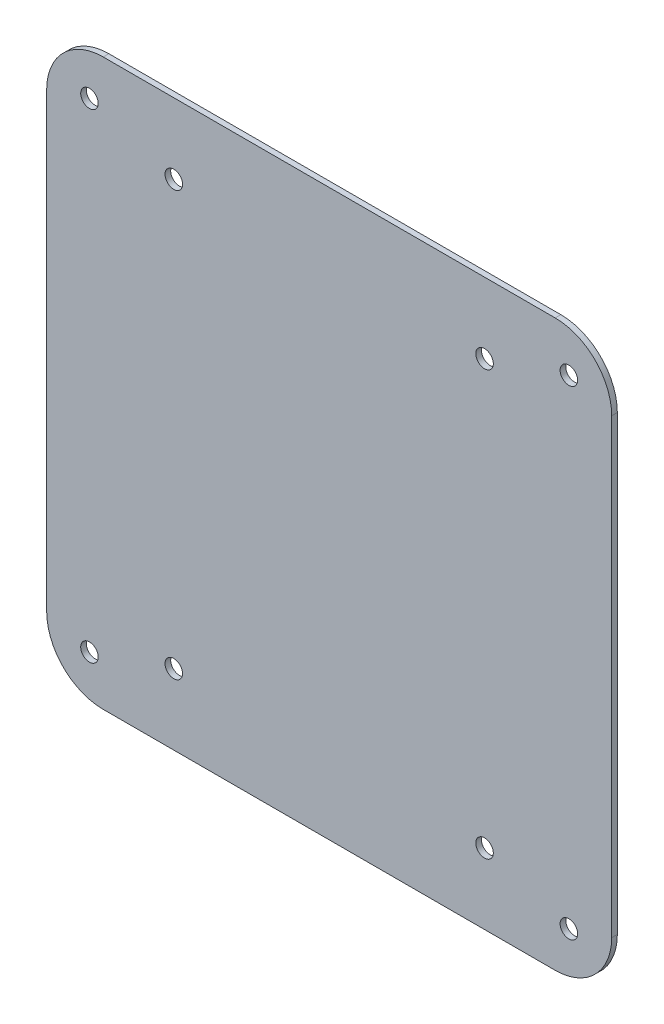
ISO-10303-21;
HEADER;
FILE_DESCRIPTION(('STEP AP214'),'2;1');
FILE_NAME('part.step','',(''),(''),'','','');
FILE_SCHEMA(('AUTOMOTIVE_DESIGN { 1 0 10303 214 1 1 1 1 }'));
ENDSEC;
DATA;
#1=APPLICATION_CONTEXT('core data for automotive mechanical design processes');
#2=APPLICATION_PROTOCOL_DEFINITION('international standard','automotive_design',2000,#1);
#3=PRODUCT_CONTEXT('',#1,'mechanical');
#4=PRODUCT('Part','Part','',(#3));
#5=PRODUCT_RELATED_PRODUCT_CATEGORY('part','',(#4));
#6=PRODUCT_DEFINITION_FORMATION('','',#4);
#7=PRODUCT_DEFINITION_CONTEXT('part definition',#1,'design');
#8=PRODUCT_DEFINITION('design','',#6,#7);
#9=PRODUCT_DEFINITION_SHAPE('','',#8);
#10=(LENGTH_UNIT() NAMED_UNIT(*) SI_UNIT(.MILLI.,.METRE.));
#11=(NAMED_UNIT(*) PLANE_ANGLE_UNIT() SI_UNIT($,.RADIAN.));
#12=(NAMED_UNIT(*) SI_UNIT($,.STERADIAN.) SOLID_ANGLE_UNIT());
#13=UNCERTAINTY_MEASURE_WITH_UNIT(LENGTH_MEASURE(1.E-05),#10,'distance_accuracy_value','');
#14=(GEOMETRIC_REPRESENTATION_CONTEXT(3) GLOBAL_UNCERTAINTY_ASSIGNED_CONTEXT((#13)) GLOBAL_UNIT_ASSIGNED_CONTEXT((#10,
#11,#12)) REPRESENTATION_CONTEXT('',''));
#15=CARTESIAN_POINT('',(0.,0.,0.));
#16=DIRECTION('',(0.,0.,1.));
#17=DIRECTION('',(1.,0.,0.));
#18=AXIS2_PLACEMENT_3D('',#15,#16,#17);
#19=CARTESIAN_POINT('',(40.,40.,1.));
#20=DIRECTION('',(0.,0.,-1.));
#21=DIRECTION('',(-1.,0.,0.));
#22=AXIS2_PLACEMENT_3D('',#19,#20,#21);
#23=PLANE('',#22);
#24=CARTESIAN_POINT('',(40.,40.,1.));
#25=DIRECTION('',(0.,0.,1.));
#26=DIRECTION('',(-1.,0.,0.));
#27=AXIS2_PLACEMENT_3D('',#24,#25,#26);
#28=CIRCLE('',#27,10.);
#29=CARTESIAN_POINT('',(50.,40.,1.));
#30=VERTEX_POINT('',#29);
#31=CARTESIAN_POINT('',(40.,50.,1.));
#32=VERTEX_POINT('',#31);
#33=EDGE_CURVE('E164',#30,#32,#28,.T.);
#34=ORIENTED_EDGE('',*,*,#33,.T.);
#35=DIRECTION('',(-1.,0.,0.));
#36=VECTOR('',#35,1.);
#37=CARTESIAN_POINT('',(-40.,50.,1.));
#38=LINE('',#37,#36);
#39=CARTESIAN_POINT('',(-40.,50.,1.));
#40=VERTEX_POINT('',#39);
#41=EDGE_CURVE('E100',#32,#40,#38,.T.);
#42=ORIENTED_EDGE('',*,*,#41,.T.);
#43=CARTESIAN_POINT('',(-40.,40.,1.));
#44=DIRECTION('',(0.,0.,1.));
#45=DIRECTION('',(-1.,0.,0.));
#46=AXIS2_PLACEMENT_3D('',#43,#44,#45);
#47=CIRCLE('',#46,10.);
#48=CARTESIAN_POINT('',(-50.,40.,1.));
#49=VERTEX_POINT('',#48);
#50=EDGE_CURVE('E185',#40,#49,#47,.T.);
#51=ORIENTED_EDGE('',*,*,#50,.T.);
#52=DIRECTION('',(0.,-1.,0.));
#53=VECTOR('',#52,1.);
#54=CARTESIAN_POINT('',(-50.,-40.,1.));
#55=LINE('',#54,#53);
#56=CARTESIAN_POINT('',(-50.,-40.,1.));
#57=VERTEX_POINT('',#56);
#58=EDGE_CURVE('E199',#49,#57,#55,.T.);
#59=ORIENTED_EDGE('',*,*,#58,.T.);
#60=CARTESIAN_POINT('',(-40.,-40.,1.));
#61=DIRECTION('',(0.,0.,1.));
#62=DIRECTION('',(-1.,0.,0.));
#63=AXIS2_PLACEMENT_3D('',#60,#61,#62);
#64=CIRCLE('',#63,10.);
#65=CARTESIAN_POINT('',(-40.,-50.,1.));
#66=VERTEX_POINT('',#65);
#67=EDGE_CURVE('E119',#57,#66,#64,.T.);
#68=ORIENTED_EDGE('',*,*,#67,.T.);
#69=DIRECTION('',(1.,0.,0.));
#70=VECTOR('',#69,1.);
#71=CARTESIAN_POINT('',(-40.,-50.,1.));
#72=LINE('',#71,#70);
#73=CARTESIAN_POINT('',(40.,-50.,1.));
#74=VERTEX_POINT('',#73);
#75=EDGE_CURVE('E113',#66,#74,#72,.T.);
#76=ORIENTED_EDGE('',*,*,#75,.T.);
#77=CARTESIAN_POINT('',(40.,-40.,1.));
#78=DIRECTION('',(0.,0.,1.));
#79=DIRECTION('',(1.,0.,0.));
#80=AXIS2_PLACEMENT_3D('',#77,#78,#79);
#81=CIRCLE('',#80,10.);
#82=CARTESIAN_POINT('',(50.,-40.,1.));
#83=VERTEX_POINT('',#82);
#84=EDGE_CURVE('E117',#74,#83,#81,.T.);
#85=ORIENTED_EDGE('',*,*,#84,.T.);
#86=DIRECTION('',(0.,1.,0.));
#87=VECTOR('',#86,1.);
#88=CARTESIAN_POINT('',(50.,-40.,1.));
#89=LINE('',#88,#87);
#90=EDGE_CURVE('E57',#83,#30,#89,.T.);
#91=ORIENTED_EDGE('',*,*,#90,.T.);
#92=EDGE_LOOP('',(#34,#42,#51,#59,#68,#76,#85,#91));
#93=FACE_BOUND('',#92,.T.);
#94=CARTESIAN_POINT('',(-27.5,37.5,1.));
#95=DIRECTION('',(0.,0.,1.));
#96=DIRECTION('',(1.,0.,0.));
#97=AXIS2_PLACEMENT_3D('',#94,#95,#96);
#98=CIRCLE('',#97,1.55);
#99=CARTESIAN_POINT('',(-25.95,37.5,1.));
#100=VERTEX_POINT('',#99);
#101=EDGE_CURVE('E146',#100,#100,#98,.T.);
#102=ORIENTED_EDGE('',*,*,#101,.F.);
#103=EDGE_LOOP('',(#102));
#104=FACE_BOUND('',#103,.T.);
#105=CARTESIAN_POINT('',(27.5,37.5,1.));
#106=DIRECTION('',(0.,0.,1.));
#107=DIRECTION('',(1.,0.,0.));
#108=AXIS2_PLACEMENT_3D('',#105,#106,#107);
#109=CIRCLE('',#108,1.55);
#110=CARTESIAN_POINT('',(29.05,37.5,1.));
#111=VERTEX_POINT('',#110);
#112=EDGE_CURVE('E213',#111,#111,#109,.T.);
#113=ORIENTED_EDGE('',*,*,#112,.F.);
#114=EDGE_LOOP('',(#113));
#115=FACE_BOUND('',#114,.T.);
#116=CARTESIAN_POINT('',(27.5,-37.5,1.));
#117=DIRECTION('',(0.,0.,1.));
#118=DIRECTION('',(1.,0.,0.));
#119=AXIS2_PLACEMENT_3D('',#116,#117,#118);
#120=CIRCLE('',#119,1.55);
#121=CARTESIAN_POINT('',(29.05,-37.5,1.));
#122=VERTEX_POINT('',#121);
#123=EDGE_CURVE('E221',#122,#122,#120,.T.);
#124=ORIENTED_EDGE('',*,*,#123,.F.);
#125=EDGE_LOOP('',(#124));
#126=FACE_BOUND('',#125,.T.);
#127=CARTESIAN_POINT('',(-27.5,-37.5,1.));
#128=DIRECTION('',(0.,0.,1.));
#129=DIRECTION('',(1.,0.,0.));
#130=AXIS2_PLACEMENT_3D('',#127,#128,#129);
#131=CIRCLE('',#130,1.55);
#132=CARTESIAN_POINT('',(-25.95,-37.5,1.));
#133=VERTEX_POINT('',#132);
#134=EDGE_CURVE('E229',#133,#133,#131,.T.);
#135=ORIENTED_EDGE('',*,*,#134,.F.);
#136=EDGE_LOOP('',(#135));
#137=FACE_BOUND('',#136,.T.);
#138=CARTESIAN_POINT('',(-42.4264068711929,42.4264068711928,1.));
#139=DIRECTION('',(0.,0.,1.));
#140=DIRECTION('',(1.,0.,0.));
#141=AXIS2_PLACEMENT_3D('',#138,#139,#140);
#142=CIRCLE('',#141,1.55);
#143=CARTESIAN_POINT('',(-40.8764068711928,42.4264068711928,1.));
#144=VERTEX_POINT('',#143);
#145=EDGE_CURVE('E237',#144,#144,#142,.T.);
#146=ORIENTED_EDGE('',*,*,#145,.F.);
#147=EDGE_LOOP('',(#146));
#148=FACE_BOUND('',#147,.T.);
#149=CARTESIAN_POINT('',(42.4264068711928,42.4264068711928,1.));
#150=DIRECTION('',(0.,0.,1.));
#151=DIRECTION('',(-1.,0.,0.));
#152=AXIS2_PLACEMENT_3D('',#149,#150,#151);
#153=CIRCLE('',#152,1.55);
#154=CARTESIAN_POINT('',(40.8764068711928,42.4264068711928,1.));
#155=VERTEX_POINT('',#154);
#156=EDGE_CURVE('E245',#155,#155,#153,.T.);
#157=ORIENTED_EDGE('',*,*,#156,.F.);
#158=EDGE_LOOP('',(#157));
#159=FACE_BOUND('',#158,.T.);
#160=CARTESIAN_POINT('',(42.4264068711928,-42.4264068711928,1.));
#161=DIRECTION('',(0.,0.,1.));
#162=DIRECTION('',(1.,0.,0.));
#163=AXIS2_PLACEMENT_3D('',#160,#161,#162);
#164=CIRCLE('',#163,1.55);
#165=CARTESIAN_POINT('',(43.9764068711928,-42.4264068711928,1.));
#166=VERTEX_POINT('',#165);
#167=EDGE_CURVE('E253',#166,#166,#164,.T.);
#168=ORIENTED_EDGE('',*,*,#167,.F.);
#169=EDGE_LOOP('',(#168));
#170=FACE_BOUND('',#169,.T.);
#171=CARTESIAN_POINT('',(-42.4264068711929,-42.4264068711928,1.));
#172=DIRECTION('',(0.,0.,1.));
#173=DIRECTION('',(-1.,0.,0.));
#174=AXIS2_PLACEMENT_3D('',#171,#172,#173);
#175=CIRCLE('',#174,1.55);
#176=CARTESIAN_POINT('',(-43.9764068711929,-42.4264068711928,1.));
#177=VERTEX_POINT('',#176);
#178=EDGE_CURVE('E261',#177,#177,#175,.T.);
#179=ORIENTED_EDGE('',*,*,#178,.F.);
#180=EDGE_LOOP('',(#179));
#181=FACE_BOUND('',#180,.T.);
#182=ADVANCED_FACE('F39',(#93,#104,#115,#126,#137,#148,#159,#170,#181),#23,.F.);
#183=CARTESIAN_POINT('',(40.,40.,0.));
#184=DIRECTION('',(0.,0.,-1.));
#185=DIRECTION('',(-1.,0.,0.));
#186=AXIS2_PLACEMENT_3D('',#183,#184,#185);
#187=PLANE('',#186);
#188=CARTESIAN_POINT('',(42.4264068711928,-42.4264068711928,0.));
#189=DIRECTION('',(0.,0.,1.));
#190=DIRECTION('',(1.,0.,0.));
#191=AXIS2_PLACEMENT_3D('',#188,#189,#190);
#192=CIRCLE('',#191,1.55);
#193=CARTESIAN_POINT('',(43.9764068711928,-42.4264068711928,0.));
#194=VERTEX_POINT('',#193);
#195=EDGE_CURVE('E257',#194,#194,#192,.T.);
#196=ORIENTED_EDGE('',*,*,#195,.T.);
#197=EDGE_LOOP('',(#196));
#198=FACE_BOUND('',#197,.T.);
#199=CARTESIAN_POINT('',(-42.4264068711929,42.4264068711928,0.));
#200=DIRECTION('',(0.,0.,1.));
#201=DIRECTION('',(1.,0.,0.));
#202=AXIS2_PLACEMENT_3D('',#199,#200,#201);
#203=CIRCLE('',#202,1.55);
#204=CARTESIAN_POINT('',(-40.8764068711928,42.4264068711928,0.));
#205=VERTEX_POINT('',#204);
#206=EDGE_CURVE('E241',#205,#205,#203,.T.);
#207=ORIENTED_EDGE('',*,*,#206,.T.);
#208=EDGE_LOOP('',(#207));
#209=FACE_BOUND('',#208,.T.);
#210=CARTESIAN_POINT('',(27.5,-37.5,0.));
#211=DIRECTION('',(0.,0.,1.));
#212=DIRECTION('',(1.,0.,0.));
#213=AXIS2_PLACEMENT_3D('',#210,#211,#212);
#214=CIRCLE('',#213,1.55);
#215=CARTESIAN_POINT('',(29.05,-37.5,0.));
#216=VERTEX_POINT('',#215);
#217=EDGE_CURVE('E225',#216,#216,#214,.T.);
#218=ORIENTED_EDGE('',*,*,#217,.T.);
#219=EDGE_LOOP('',(#218));
#220=FACE_BOUND('',#219,.T.);
#221=CARTESIAN_POINT('',(-27.5,37.5,0.));
#222=DIRECTION('',(0.,0.,1.));
#223=DIRECTION('',(1.,0.,0.));
#224=AXIS2_PLACEMENT_3D('',#221,#222,#223);
#225=CIRCLE('',#224,1.55);
#226=CARTESIAN_POINT('',(-25.95,37.5,0.));
#227=VERTEX_POINT('',#226);
#228=EDGE_CURVE('E209',#227,#227,#225,.T.);
#229=ORIENTED_EDGE('',*,*,#228,.T.);
#230=EDGE_LOOP('',(#229));
#231=FACE_BOUND('',#230,.T.);
#232=CARTESIAN_POINT('',(40.,40.,0.));
#233=DIRECTION('',(0.,0.,1.));
#234=DIRECTION('',(-1.,0.,0.));
#235=AXIS2_PLACEMENT_3D('',#232,#233,#234);
#236=CIRCLE('',#235,10.);
#237=CARTESIAN_POINT('',(50.,40.,0.));
#238=VERTEX_POINT('',#237);
#239=CARTESIAN_POINT('',(40.,50.,0.));
#240=VERTEX_POINT('',#239);
#241=EDGE_CURVE('E141',#238,#240,#236,.T.);
#242=ORIENTED_EDGE('',*,*,#241,.F.);
#243=DIRECTION('',(0.,1.,0.));
#244=VECTOR('',#243,1.);
#245=CARTESIAN_POINT('',(50.,-40.,0.));
#246=LINE('',#245,#244);
#247=CARTESIAN_POINT('',(50.,-40.,0.));
#248=VERTEX_POINT('',#247);
#249=EDGE_CURVE('E92',#248,#238,#246,.T.);
#250=ORIENTED_EDGE('',*,*,#249,.F.);
#251=CARTESIAN_POINT('',(40.,-40.,0.));
#252=DIRECTION('',(0.,0.,1.));
#253=DIRECTION('',(1.,0.,0.));
#254=AXIS2_PLACEMENT_3D('',#251,#252,#253);
#255=CIRCLE('',#254,10.);
#256=CARTESIAN_POINT('',(40.,-50.,0.));
#257=VERTEX_POINT('',#256);
#258=EDGE_CURVE('E86',#257,#248,#255,.T.);
#259=ORIENTED_EDGE('',*,*,#258,.F.);
#260=DIRECTION('',(1.,0.,0.));
#261=VECTOR('',#260,1.);
#262=CARTESIAN_POINT('',(-40.,-50.,0.));
#263=LINE('',#262,#261);
#264=CARTESIAN_POINT('',(-40.,-50.,0.));
#265=VERTEX_POINT('',#264);
#266=EDGE_CURVE('E128',#265,#257,#263,.T.);
#267=ORIENTED_EDGE('',*,*,#266,.F.);
#268=CARTESIAN_POINT('',(-40.,-40.,0.));
#269=DIRECTION('',(0.,0.,1.));
#270=DIRECTION('',(-1.,0.,0.));
#271=AXIS2_PLACEMENT_3D('',#268,#269,#270);
#272=CIRCLE('',#271,10.);
#273=CARTESIAN_POINT('',(-50.,-40.,0.));
#274=VERTEX_POINT('',#273);
#275=EDGE_CURVE('E155',#274,#265,#272,.T.);
#276=ORIENTED_EDGE('',*,*,#275,.F.);
#277=DIRECTION('',(0.,-1.,0.));
#278=VECTOR('',#277,1.);
#279=CARTESIAN_POINT('',(-50.,-40.,0.));
#280=LINE('',#279,#278);
#281=CARTESIAN_POINT('',(-50.,40.,0.));
#282=VERTEX_POINT('',#281);
#283=EDGE_CURVE('E152',#282,#274,#280,.T.);
#284=ORIENTED_EDGE('',*,*,#283,.F.);
#285=CARTESIAN_POINT('',(-40.,40.,0.));
#286=DIRECTION('',(0.,0.,1.));
#287=DIRECTION('',(-1.,0.,0.));
#288=AXIS2_PLACEMENT_3D('',#285,#286,#287);
#289=CIRCLE('',#288,10.);
#290=CARTESIAN_POINT('',(-40.,50.,0.));
#291=VERTEX_POINT('',#290);
#292=EDGE_CURVE('E149',#291,#282,#289,.T.);
#293=ORIENTED_EDGE('',*,*,#292,.F.);
#294=DIRECTION('',(-1.,0.,0.));
#295=VECTOR('',#294,1.);
#296=CARTESIAN_POINT('',(-40.,50.,0.));
#297=LINE('',#296,#295);
#298=EDGE_CURVE('E145',#240,#291,#297,.T.);
#299=ORIENTED_EDGE('',*,*,#298,.F.);
#300=EDGE_LOOP('',(#242,#250,#259,#267,#276,#284,#293,#299));
#301=FACE_BOUND('',#300,.T.);
#302=CARTESIAN_POINT('',(27.5,37.5,0.));
#303=DIRECTION('',(0.,0.,1.));
#304=DIRECTION('',(1.,0.,0.));
#305=AXIS2_PLACEMENT_3D('',#302,#303,#304);
#306=CIRCLE('',#305,1.55);
#307=CARTESIAN_POINT('',(29.05,37.5,0.));
#308=VERTEX_POINT('',#307);
#309=EDGE_CURVE('E217',#308,#308,#306,.T.);
#310=ORIENTED_EDGE('',*,*,#309,.T.);
#311=EDGE_LOOP('',(#310));
#312=FACE_BOUND('',#311,.T.);
#313=CARTESIAN_POINT('',(-27.5,-37.5,0.));
#314=DIRECTION('',(0.,0.,1.));
#315=DIRECTION('',(1.,0.,0.));
#316=AXIS2_PLACEMENT_3D('',#313,#314,#315);
#317=CIRCLE('',#316,1.55);
#318=CARTESIAN_POINT('',(-25.95,-37.5,0.));
#319=VERTEX_POINT('',#318);
#320=EDGE_CURVE('E233',#319,#319,#317,.T.);
#321=ORIENTED_EDGE('',*,*,#320,.T.);
#322=EDGE_LOOP('',(#321));
#323=FACE_BOUND('',#322,.T.);
#324=CARTESIAN_POINT('',(42.4264068711928,42.4264068711928,0.));
#325=DIRECTION('',(0.,0.,1.));
#326=DIRECTION('',(-1.,0.,0.));
#327=AXIS2_PLACEMENT_3D('',#324,#325,#326);
#328=CIRCLE('',#327,1.55);
#329=CARTESIAN_POINT('',(40.8764068711928,42.4264068711928,0.));
#330=VERTEX_POINT('',#329);
#331=EDGE_CURVE('E249',#330,#330,#328,.T.);
#332=ORIENTED_EDGE('',*,*,#331,.T.);
#333=EDGE_LOOP('',(#332));
#334=FACE_BOUND('',#333,.T.);
#335=CARTESIAN_POINT('',(-42.4264068711929,-42.4264068711928,0.));
#336=DIRECTION('',(0.,0.,1.));
#337=DIRECTION('',(-1.,0.,0.));
#338=AXIS2_PLACEMENT_3D('',#335,#336,#337);
#339=CIRCLE('',#338,1.55);
#340=CARTESIAN_POINT('',(-43.9764068711929,-42.4264068711928,0.));
#341=VERTEX_POINT('',#340);
#342=EDGE_CURVE('E265',#341,#341,#339,.T.);
#343=ORIENTED_EDGE('',*,*,#342,.T.);
#344=EDGE_LOOP('',(#343));
#345=FACE_BOUND('',#344,.T.);
#346=ADVANCED_FACE('F189',(#198,#209,#220,#231,#301,#312,#323,#334,#345),#187,.T.);
#347=CARTESIAN_POINT('',(40.,40.,1.));
#348=DIRECTION('',(0.,0.,-1.));
#349=DIRECTION('',(-1.,0.,0.));
#350=AXIS2_PLACEMENT_3D('',#347,#348,#349);
#351=CYLINDRICAL_SURFACE('',#350,10.);
#352=ORIENTED_EDGE('',*,*,#241,.T.);
#353=DIRECTION('',(0.,0.,-1.));
#354=VECTOR('',#353,1.);
#355=CARTESIAN_POINT('',(40.,50.,1.));
#356=LINE('',#355,#354);
#357=EDGE_CURVE('E11',#32,#240,#356,.T.);
#358=ORIENTED_EDGE('',*,*,#357,.F.);
#359=ORIENTED_EDGE('',*,*,#33,.F.);
#360=DIRECTION('',(0.,0.,-1.));
#361=VECTOR('',#360,1.);
#362=CARTESIAN_POINT('',(50.,40.,1.));
#363=LINE('',#362,#361);
#364=EDGE_CURVE('E137',#30,#238,#363,.T.);
#365=ORIENTED_EDGE('',*,*,#364,.T.);
#366=EDGE_LOOP('',(#352,#358,#359,#365));
#367=FACE_BOUND('',#366,.T.);
#368=ADVANCED_FACE('F41',(#367),#351,.T.);
#369=CARTESIAN_POINT('',(-40.,50.,1.));
#370=DIRECTION('',(0.,-1.,0.));
#371=DIRECTION('',(0.,0.,-1.));
#372=AXIS2_PLACEMENT_3D('',#369,#370,#371);
#373=PLANE('',#372);
#374=ORIENTED_EDGE('',*,*,#298,.T.);
#375=DIRECTION('',(0.,0.,-1.));
#376=VECTOR('',#375,1.);
#377=CARTESIAN_POINT('',(-40.,50.,1.));
#378=LINE('',#377,#376);
#379=EDGE_CURVE('E49',#40,#291,#378,.T.);
#380=ORIENTED_EDGE('',*,*,#379,.F.);
#381=ORIENTED_EDGE('',*,*,#41,.F.);
#382=ORIENTED_EDGE('',*,*,#357,.T.);
#383=EDGE_LOOP('',(#374,#380,#381,#382));
#384=FACE_BOUND('',#383,.T.);
#385=ADVANCED_FACE('F299',(#384),#373,.F.);
#386=CARTESIAN_POINT('',(-40.,40.,1.));
#387=DIRECTION('',(0.,0.,-1.));
#388=DIRECTION('',(-1.,0.,0.));
#389=AXIS2_PLACEMENT_3D('',#386,#387,#388);
#390=CYLINDRICAL_SURFACE('',#389,10.);
#391=ORIENTED_EDGE('',*,*,#292,.T.);
#392=DIRECTION('',(0.,0.,-1.));
#393=VECTOR('',#392,1.);
#394=CARTESIAN_POINT('',(-50.,40.,1.));
#395=LINE('',#394,#393);
#396=EDGE_CURVE('E175',#49,#282,#395,.T.);
#397=ORIENTED_EDGE('',*,*,#396,.F.);
#398=ORIENTED_EDGE('',*,*,#50,.F.);
#399=ORIENTED_EDGE('',*,*,#379,.T.);
#400=EDGE_LOOP('',(#391,#397,#398,#399));
#401=FACE_BOUND('',#400,.T.);
#402=ADVANCED_FACE('F183',(#401),#390,.T.);
#403=CARTESIAN_POINT('',(-50.,-40.,1.));
#404=DIRECTION('',(1.,0.,0.));
#405=DIRECTION('',(0.,0.,-1.));
#406=AXIS2_PLACEMENT_3D('',#403,#404,#405);
#407=PLANE('',#406);
#408=ORIENTED_EDGE('',*,*,#283,.T.);
#409=DIRECTION('',(0.,0.,-1.));
#410=VECTOR('',#409,1.);
#411=CARTESIAN_POINT('',(-50.,-40.,1.));
#412=LINE('',#411,#410);
#413=EDGE_CURVE('E171',#57,#274,#412,.T.);
#414=ORIENTED_EDGE('',*,*,#413,.F.);
#415=ORIENTED_EDGE('',*,*,#58,.F.);
#416=ORIENTED_EDGE('',*,*,#396,.T.);
#417=EDGE_LOOP('',(#408,#414,#415,#416));
#418=FACE_BOUND('',#417,.T.);
#419=ADVANCED_FACE('F194',(#418),#407,.F.);
#420=CARTESIAN_POINT('',(-40.,-40.,1.));
#421=DIRECTION('',(0.,0.,-1.));
#422=DIRECTION('',(-1.,0.,0.));
#423=AXIS2_PLACEMENT_3D('',#420,#421,#422);
#424=CYLINDRICAL_SURFACE('',#423,10.);
#425=ORIENTED_EDGE('',*,*,#275,.T.);
#426=DIRECTION('',(0.,0.,-1.));
#427=VECTOR('',#426,1.);
#428=CARTESIAN_POINT('',(-40.,-50.,1.));
#429=LINE('',#428,#427);
#430=EDGE_CURVE('E130',#66,#265,#429,.T.);
#431=ORIENTED_EDGE('',*,*,#430,.F.);
#432=ORIENTED_EDGE('',*,*,#67,.F.);
#433=ORIENTED_EDGE('',*,*,#413,.T.);
#434=EDGE_LOOP('',(#425,#431,#432,#433));
#435=FACE_BOUND('',#434,.T.);
#436=ADVANCED_FACE('F197',(#435),#424,.T.);
#437=CARTESIAN_POINT('',(-40.,-50.,1.));
#438=DIRECTION('',(0.,1.,0.));
#439=DIRECTION('',(0.,0.,1.));
#440=AXIS2_PLACEMENT_3D('',#437,#438,#439);
#441=PLANE('',#440);
#442=ORIENTED_EDGE('',*,*,#266,.T.);
#443=DIRECTION('',(0.,0.,-1.));
#444=VECTOR('',#443,1.);
#445=CARTESIAN_POINT('',(40.,-50.,1.));
#446=LINE('',#445,#444);
#447=EDGE_CURVE('E125',#74,#257,#446,.T.);
#448=ORIENTED_EDGE('',*,*,#447,.F.);
#449=ORIENTED_EDGE('',*,*,#75,.F.);
#450=ORIENTED_EDGE('',*,*,#430,.T.);
#451=EDGE_LOOP('',(#442,#448,#449,#450));
#452=FACE_BOUND('',#451,.T.);
#453=ADVANCED_FACE('F126',(#452),#441,.F.);
#454=CARTESIAN_POINT('',(40.,-40.,1.));
#455=DIRECTION('',(0.,0.,-1.));
#456=DIRECTION('',(-1.,0.,0.));
#457=AXIS2_PLACEMENT_3D('',#454,#455,#456);
#458=CYLINDRICAL_SURFACE('',#457,10.);
#459=ORIENTED_EDGE('',*,*,#258,.T.);
#460=DIRECTION('',(0.,0.,-1.));
#461=VECTOR('',#460,1.);
#462=CARTESIAN_POINT('',(50.,-40.,1.));
#463=LINE('',#462,#461);
#464=EDGE_CURVE('E131',#83,#248,#463,.T.);
#465=ORIENTED_EDGE('',*,*,#464,.F.);
#466=ORIENTED_EDGE('',*,*,#84,.F.);
#467=ORIENTED_EDGE('',*,*,#447,.T.);
#468=EDGE_LOOP('',(#459,#465,#466,#467));
#469=FACE_BOUND('',#468,.T.);
#470=ADVANCED_FACE('F133',(#469),#458,.T.);
#471=CARTESIAN_POINT('',(50.,-40.,1.));
#472=DIRECTION('',(-1.,0.,0.));
#473=DIRECTION('',(0.,0.,1.));
#474=AXIS2_PLACEMENT_3D('',#471,#472,#473);
#475=PLANE('',#474);
#476=ORIENTED_EDGE('',*,*,#249,.T.);
#477=ORIENTED_EDGE('',*,*,#364,.F.);
#478=ORIENTED_EDGE('',*,*,#90,.F.);
#479=ORIENTED_EDGE('',*,*,#464,.T.);
#480=EDGE_LOOP('',(#476,#477,#478,#479));
#481=FACE_BOUND('',#480,.T.);
#482=ADVANCED_FACE('F287',(#481),#475,.F.);
#483=CARTESIAN_POINT('',(-27.5,37.5,1.));
#484=DIRECTION('',(0.,0.,-1.));
#485=DIRECTION('',(-1.,0.,0.));
#486=AXIS2_PLACEMENT_3D('',#483,#484,#485);
#487=CYLINDRICAL_SURFACE('',#486,1.55);
#488=ORIENTED_EDGE('',*,*,#101,.T.);
#489=EDGE_LOOP('',(#488));
#490=FACE_BOUND('',#489,.T.);
#491=ORIENTED_EDGE('',*,*,#228,.F.);
#492=EDGE_LOOP('',(#491));
#493=FACE_BOUND('',#492,.T.);
#494=ADVANCED_FACE('F284',(#490,#493),#487,.F.);
#495=CARTESIAN_POINT('',(27.5,37.5,1.));
#496=DIRECTION('',(0.,0.,-1.));
#497=DIRECTION('',(-1.,0.,0.));
#498=AXIS2_PLACEMENT_3D('',#495,#496,#497);
#499=CYLINDRICAL_SURFACE('',#498,1.55);
#500=ORIENTED_EDGE('',*,*,#112,.T.);
#501=EDGE_LOOP('',(#500));
#502=FACE_BOUND('',#501,.T.);
#503=ORIENTED_EDGE('',*,*,#309,.F.);
#504=EDGE_LOOP('',(#503));
#505=FACE_BOUND('',#504,.T.);
#506=ADVANCED_FACE('F363',(#502,#505),#499,.F.);
#507=CARTESIAN_POINT('',(27.5,-37.5,1.));
#508=DIRECTION('',(0.,0.,-1.));
#509=DIRECTION('',(-1.,0.,0.));
#510=AXIS2_PLACEMENT_3D('',#507,#508,#509);
#511=CYLINDRICAL_SURFACE('',#510,1.55);
#512=ORIENTED_EDGE('',*,*,#123,.T.);
#513=EDGE_LOOP('',(#512));
#514=FACE_BOUND('',#513,.T.);
#515=ORIENTED_EDGE('',*,*,#217,.F.);
#516=EDGE_LOOP('',(#515));
#517=FACE_BOUND('',#516,.T.);
#518=ADVANCED_FACE('F371',(#514,#517),#511,.F.);
#519=CARTESIAN_POINT('',(-27.5,-37.5,1.));
#520=DIRECTION('',(0.,0.,-1.));
#521=DIRECTION('',(-1.,0.,0.));
#522=AXIS2_PLACEMENT_3D('',#519,#520,#521);
#523=CYLINDRICAL_SURFACE('',#522,1.55);
#524=ORIENTED_EDGE('',*,*,#134,.T.);
#525=EDGE_LOOP('',(#524));
#526=FACE_BOUND('',#525,.T.);
#527=ORIENTED_EDGE('',*,*,#320,.F.);
#528=EDGE_LOOP('',(#527));
#529=FACE_BOUND('',#528,.T.);
#530=ADVANCED_FACE('F379',(#526,#529),#523,.F.);
#531=CARTESIAN_POINT('',(-42.4264068711929,42.4264068711928,1.));
#532=DIRECTION('',(0.,0.,-1.));
#533=DIRECTION('',(-1.,0.,0.));
#534=AXIS2_PLACEMENT_3D('',#531,#532,#533);
#535=CYLINDRICAL_SURFACE('',#534,1.55);
#536=ORIENTED_EDGE('',*,*,#145,.T.);
#537=EDGE_LOOP('',(#536));
#538=FACE_BOUND('',#537,.T.);
#539=ORIENTED_EDGE('',*,*,#206,.F.);
#540=EDGE_LOOP('',(#539));
#541=FACE_BOUND('',#540,.T.);
#542=ADVANCED_FACE('F388',(#538,#541),#535,.F.);
#543=CARTESIAN_POINT('',(42.4264068711928,42.4264068711928,1.));
#544=DIRECTION('',(0.,0.,-1.));
#545=DIRECTION('',(-1.,0.,0.));
#546=AXIS2_PLACEMENT_3D('',#543,#544,#545);
#547=CYLINDRICAL_SURFACE('',#546,1.55);
#548=ORIENTED_EDGE('',*,*,#156,.T.);
#549=EDGE_LOOP('',(#548));
#550=FACE_BOUND('',#549,.T.);
#551=ORIENTED_EDGE('',*,*,#331,.F.);
#552=EDGE_LOOP('',(#551));
#553=FACE_BOUND('',#552,.T.);
#554=ADVANCED_FACE('F397',(#550,#553),#547,.F.);
#555=CARTESIAN_POINT('',(42.4264068711928,-42.4264068711928,1.));
#556=DIRECTION('',(0.,0.,-1.));
#557=DIRECTION('',(-1.,0.,0.));
#558=AXIS2_PLACEMENT_3D('',#555,#556,#557);
#559=CYLINDRICAL_SURFACE('',#558,1.55);
#560=ORIENTED_EDGE('',*,*,#167,.T.);
#561=EDGE_LOOP('',(#560));
#562=FACE_BOUND('',#561,.T.);
#563=ORIENTED_EDGE('',*,*,#195,.F.);
#564=EDGE_LOOP('',(#563));
#565=FACE_BOUND('',#564,.T.);
#566=ADVANCED_FACE('F406',(#562,#565),#559,.F.);
#567=CARTESIAN_POINT('',(-42.4264068711929,-42.4264068711928,1.));
#568=DIRECTION('',(0.,0.,-1.));
#569=DIRECTION('',(-1.,0.,0.));
#570=AXIS2_PLACEMENT_3D('',#567,#568,#569);
#571=CYLINDRICAL_SURFACE('',#570,1.55);
#572=ORIENTED_EDGE('',*,*,#178,.T.);
#573=EDGE_LOOP('',(#572));
#574=FACE_BOUND('',#573,.T.);
#575=ORIENTED_EDGE('',*,*,#342,.F.);
#576=EDGE_LOOP('',(#575));
#577=FACE_BOUND('',#576,.T.);
#578=ADVANCED_FACE('F273',(#574,#577),#571,.F.);
#579=CLOSED_SHELL('',(#182,#346,#368,#385,#402,#419,#436,#453,#470,#482,#494,#506,#518,#530,
#542,#554,#566,#578));
#580=MANIFOLD_SOLID_BREP('B2',#579);
#581=ADVANCED_BREP_SHAPE_REPRESENTATION('',(#18,#580),#14);
#582=SHAPE_DEFINITION_REPRESENTATION(#9,#581);
ENDSEC;
END-ISO-10303-21;
